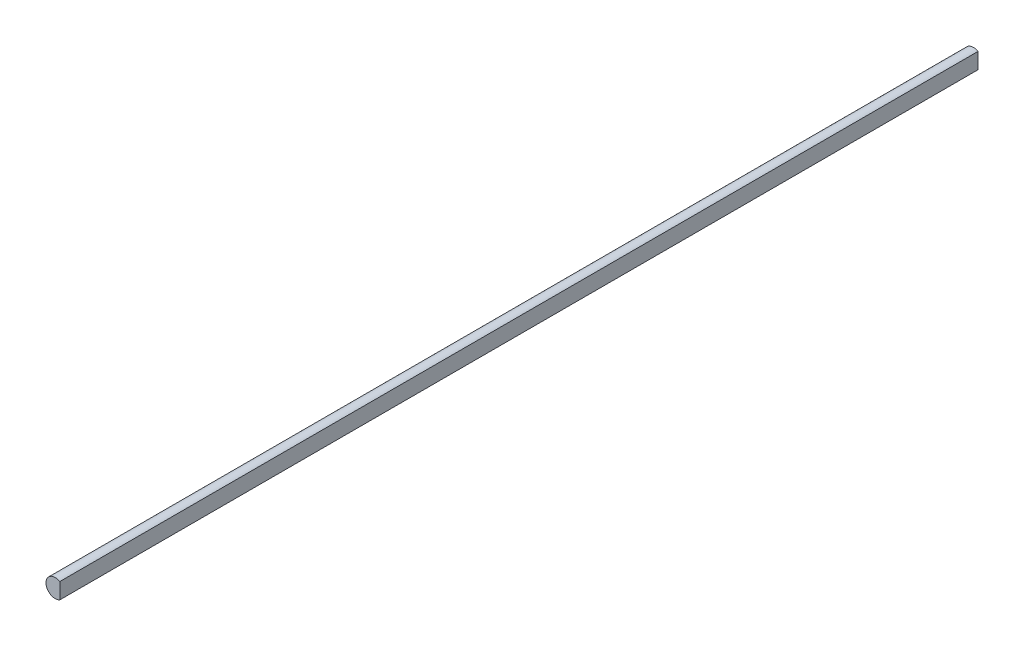
ISO-10303-21;
HEADER;
FILE_DESCRIPTION(('STEP AP214'),'2;1');
FILE_NAME('part.step','',(''),(''),'','','');
FILE_SCHEMA(('AUTOMOTIVE_DESIGN { 1 0 10303 214 1 1 1 1 }'));
ENDSEC;
DATA;
#1=APPLICATION_CONTEXT('core data for automotive mechanical design processes');
#2=APPLICATION_PROTOCOL_DEFINITION('international standard','automotive_design',2000,#1);
#3=PRODUCT_CONTEXT('',#1,'mechanical');
#4=PRODUCT('Part','Part','',(#3));
#5=PRODUCT_RELATED_PRODUCT_CATEGORY('part','',(#4));
#6=PRODUCT_DEFINITION_FORMATION('','',#4);
#7=PRODUCT_DEFINITION_CONTEXT('part definition',#1,'design');
#8=PRODUCT_DEFINITION('design','',#6,#7);
#9=PRODUCT_DEFINITION_SHAPE('','',#8);
#10=(LENGTH_UNIT() NAMED_UNIT(*) SI_UNIT(.MILLI.,.METRE.));
#11=(NAMED_UNIT(*) PLANE_ANGLE_UNIT() SI_UNIT($,.RADIAN.));
#12=(NAMED_UNIT(*) SI_UNIT($,.STERADIAN.) SOLID_ANGLE_UNIT());
#13=UNCERTAINTY_MEASURE_WITH_UNIT(LENGTH_MEASURE(1.E-05),#10,'distance_accuracy_value','');
#14=(GEOMETRIC_REPRESENTATION_CONTEXT(3) GLOBAL_UNCERTAINTY_ASSIGNED_CONTEXT((#13)) GLOBAL_UNIT_ASSIGNED_CONTEXT((#10,
#11,#12)) REPRESENTATION_CONTEXT('',''));
#15=CARTESIAN_POINT('',(0.,0.,0.));
#16=DIRECTION('',(0.,0.,1.));
#17=DIRECTION('',(1.,0.,0.));
#18=AXIS2_PLACEMENT_3D('',#15,#16,#17);
#19=CARTESIAN_POINT('',(0.,0.,150.));
#20=DIRECTION('',(0.,0.,-1.));
#21=DIRECTION('',(-1.,0.,0.));
#22=AXIS2_PLACEMENT_3D('',#19,#20,#21);
#23=CYLINDRICAL_SURFACE('',#22,1.5);
#24=CARTESIAN_POINT('',(0.,0.,0.));
#25=DIRECTION('',(0.,0.,1.));
#26=DIRECTION('',(1.,0.,0.));
#27=AXIS2_PLACEMENT_3D('',#24,#25,#26);
#28=CIRCLE('',#27,1.5);
#29=CARTESIAN_POINT('',(0.75,1.29903810567666,0.));
#30=VERTEX_POINT('',#29);
#31=CARTESIAN_POINT('',(0.75,-1.29903810567666,0.));
#32=VERTEX_POINT('',#31);
#33=EDGE_CURVE('E62',#30,#32,#28,.T.);
#34=ORIENTED_EDGE('',*,*,#33,.T.);
#35=DIRECTION('',(0.,0.,-1.));
#36=VECTOR('',#35,1.);
#37=CARTESIAN_POINT('',(0.75,-1.29903810567666,150.));
#38=LINE('',#37,#36);
#39=CARTESIAN_POINT('',(0.75,-1.29903810567666,150.));
#40=VERTEX_POINT('',#39);
#41=EDGE_CURVE('E11',#40,#32,#38,.T.);
#42=ORIENTED_EDGE('',*,*,#41,.F.);
#43=CARTESIAN_POINT('',(0.,0.,150.));
#44=DIRECTION('',(0.,0.,1.));
#45=DIRECTION('',(1.,0.,0.));
#46=AXIS2_PLACEMENT_3D('',#43,#44,#45);
#47=CIRCLE('',#46,1.5);
#48=CARTESIAN_POINT('',(0.75,1.29903810567666,150.));
#49=VERTEX_POINT('',#48);
#50=EDGE_CURVE('E61',#49,#40,#47,.T.);
#51=ORIENTED_EDGE('',*,*,#50,.F.);
#52=DIRECTION('',(0.,0.,-1.));
#53=VECTOR('',#52,1.);
#54=CARTESIAN_POINT('',(0.75,1.29903810567666,150.));
#55=LINE('',#54,#53);
#56=EDGE_CURVE('E39',#49,#30,#55,.T.);
#57=ORIENTED_EDGE('',*,*,#56,.T.);
#58=EDGE_LOOP('',(#34,#42,#51,#57));
#59=FACE_BOUND('',#58,.T.);
#60=ADVANCED_FACE('F31',(#59),#23,.T.);
#61=CARTESIAN_POINT('',(0.75,1.29903810567666,150.));
#62=DIRECTION('',(-1.,0.,0.));
#63=DIRECTION('',(0.,0.,1.));
#64=AXIS2_PLACEMENT_3D('',#61,#62,#63);
#65=PLANE('',#64);
#66=DIRECTION('',(0.,1.,0.));
#67=VECTOR('',#66,1.);
#68=CARTESIAN_POINT('',(0.75,1.29903810567666,0.));
#69=LINE('',#68,#67);
#70=EDGE_CURVE('E54',#32,#30,#69,.T.);
#71=ORIENTED_EDGE('',*,*,#70,.T.);
#72=ORIENTED_EDGE('',*,*,#56,.F.);
#73=DIRECTION('',(0.,1.,0.));
#74=VECTOR('',#73,1.);
#75=CARTESIAN_POINT('',(0.75,1.29903810567666,150.));
#76=LINE('',#75,#74);
#77=EDGE_CURVE('E46',#40,#49,#76,.T.);
#78=ORIENTED_EDGE('',*,*,#77,.F.);
#79=ORIENTED_EDGE('',*,*,#41,.T.);
#80=EDGE_LOOP('',(#71,#72,#78,#79));
#81=FACE_BOUND('',#80,.T.);
#82=ADVANCED_FACE('F57',(#81),#65,.F.);
#83=CARTESIAN_POINT('',(0.,0.,150.));
#84=DIRECTION('',(0.,0.,1.));
#85=DIRECTION('',(1.,0.,0.));
#86=AXIS2_PLACEMENT_3D('',#83,#84,#85);
#87=PLANE('',#86);
#88=ORIENTED_EDGE('',*,*,#50,.T.);
#89=ORIENTED_EDGE('',*,*,#77,.T.);
#90=EDGE_LOOP('',(#88,#89));
#91=FACE_BOUND('',#90,.T.);
#92=ADVANCED_FACE('F69',(#91),#87,.T.);
#93=CARTESIAN_POINT('',(0.,0.,0.));
#94=DIRECTION('',(0.,0.,1.));
#95=DIRECTION('',(1.,0.,0.));
#96=AXIS2_PLACEMENT_3D('',#93,#94,#95);
#97=PLANE('',#96);
#98=ORIENTED_EDGE('',*,*,#33,.F.);
#99=ORIENTED_EDGE('',*,*,#70,.F.);
#100=EDGE_LOOP('',(#98,#99));
#101=FACE_BOUND('',#100,.T.);
#102=ADVANCED_FACE('F65',(#101),#97,.F.);
#103=CLOSED_SHELL('',(#60,#82,#92,#102));
#104=MANIFOLD_SOLID_BREP('B2',#103);
#105=ADVANCED_BREP_SHAPE_REPRESENTATION('',(#18,#104),#14);
#106=SHAPE_DEFINITION_REPRESENTATION(#9,#105);
ENDSEC;
END-ISO-10303-21;
